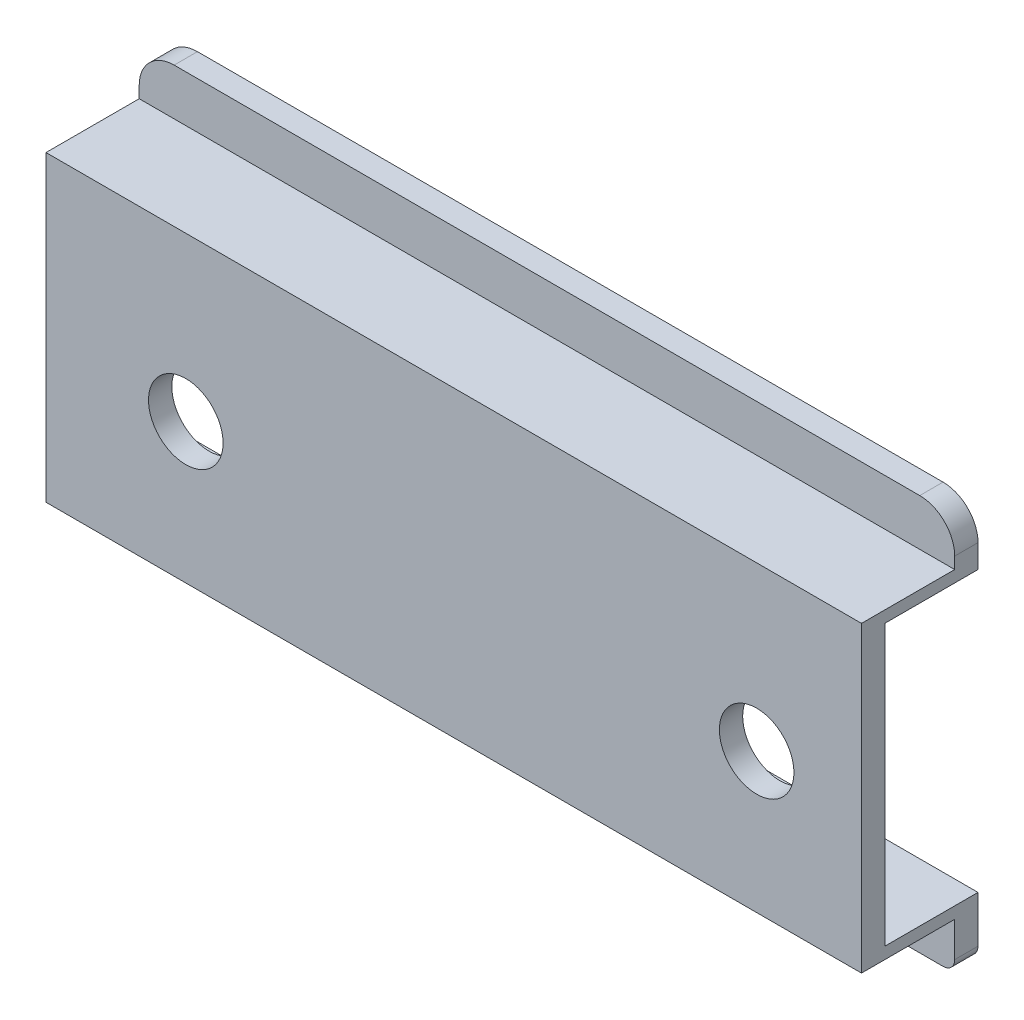
ISO-10303-21;
HEADER;
FILE_DESCRIPTION(('STEP AP214'),'2;1');
FILE_NAME('part.step','',(''),(''),'','','');
FILE_SCHEMA(('AUTOMOTIVE_DESIGN { 1 0 10303 214 1 1 1 1 }'));
ENDSEC;
DATA;
#1=APPLICATION_CONTEXT('core data for automotive mechanical design processes');
#2=APPLICATION_PROTOCOL_DEFINITION('international standard','automotive_design',2000,#1);
#3=PRODUCT_CONTEXT('',#1,'mechanical');
#4=PRODUCT('Part','Part','',(#3));
#5=PRODUCT_RELATED_PRODUCT_CATEGORY('part','',(#4));
#6=PRODUCT_DEFINITION_FORMATION('','',#4);
#7=PRODUCT_DEFINITION_CONTEXT('part definition',#1,'design');
#8=PRODUCT_DEFINITION('design','',#6,#7);
#9=PRODUCT_DEFINITION_SHAPE('','',#8);
#10=(LENGTH_UNIT() NAMED_UNIT(*) SI_UNIT(.MILLI.,.METRE.));
#11=(NAMED_UNIT(*) PLANE_ANGLE_UNIT() SI_UNIT($,.RADIAN.));
#12=(NAMED_UNIT(*) SI_UNIT($,.STERADIAN.) SOLID_ANGLE_UNIT());
#13=UNCERTAINTY_MEASURE_WITH_UNIT(LENGTH_MEASURE(1.E-05),#10,'distance_accuracy_value','');
#14=(GEOMETRIC_REPRESENTATION_CONTEXT(3) GLOBAL_UNCERTAINTY_ASSIGNED_CONTEXT((#13)) GLOBAL_UNIT_ASSIGNED_CONTEXT((#10,
#11,#12)) REPRESENTATION_CONTEXT('',''));
#15=CARTESIAN_POINT('',(0.,0.,0.));
#16=DIRECTION('',(0.,0.,1.));
#17=DIRECTION('',(1.,0.,0.));
#18=AXIS2_PLACEMENT_3D('',#15,#16,#17);
#19=CARTESIAN_POINT('',(-148.81074168798,103.606138107417,50.));
#20=DIRECTION('',(0.,0.,-1.));
#21=DIRECTION('',(-1.,0.,0.));
#22=AXIS2_PLACEMENT_3D('',#19,#20,#21);
#23=CYLINDRICAL_SURFACE('',#22,15.);
#24=DIRECTION('',(0.,0.,-1.));
#25=VECTOR('',#24,1.);
#26=CARTESIAN_POINT('',(-163.81074168798,103.606138107417,50.));
#27=LINE('',#26,#25);
#28=CARTESIAN_POINT('',(-163.81074168798,103.606138107417,10.));
#29=VERTEX_POINT('',#28);
#30=CARTESIAN_POINT('',(-163.81074168798,103.606138107417,0.));
#31=VERTEX_POINT('',#30);
#32=EDGE_CURVE('E269',#29,#31,#27,.T.);
#33=ORIENTED_EDGE('',*,*,#32,.F.);
#34=CARTESIAN_POINT('',(-148.81074168798,103.606138107417,10.));
#35=DIRECTION('',(0.,0.,1.));
#36=DIRECTION('',(1.,0.,0.));
#37=AXIS2_PLACEMENT_3D('',#34,#35,#36);
#38=CIRCLE('',#37,15.);
#39=CARTESIAN_POINT('',(-148.81074168798,118.606138107417,10.));
#40=VERTEX_POINT('',#39);
#41=EDGE_CURVE('E42',#40,#29,#38,.T.);
#42=ORIENTED_EDGE('',*,*,#41,.F.);
#43=DIRECTION('',(0.,0.,-1.));
#44=VECTOR('',#43,1.);
#45=CARTESIAN_POINT('',(-148.81074168798,118.606138107417,50.));
#46=LINE('',#45,#44);
#47=CARTESIAN_POINT('',(-148.81074168798,118.606138107417,0.));
#48=VERTEX_POINT('',#47);
#49=EDGE_CURVE('E272',#48,#40,#46,.F.);
#50=ORIENTED_EDGE('',*,*,#49,.F.);
#51=CARTESIAN_POINT('',(-148.81074168798,103.606138107417,0.));
#52=DIRECTION('',(0.,0.,-1.));
#53=DIRECTION('',(-1.,0.,0.));
#54=AXIS2_PLACEMENT_3D('',#51,#52,#53);
#55=CIRCLE('',#54,15.);
#56=EDGE_CURVE('E11',#31,#48,#55,.T.);
#57=ORIENTED_EDGE('',*,*,#56,.F.);
#58=EDGE_LOOP('',(#33,#42,#50,#57));
#59=FACE_BOUND('',#58,.T.);
#60=ADVANCED_FACE('F35',(#59),#23,.T.);
#61=CARTESIAN_POINT('',(171.18925831202,103.606138107417,50.));
#62=DIRECTION('',(0.,0.,1.));
#63=DIRECTION('',(1.,0.,0.));
#64=AXIS2_PLACEMENT_3D('',#61,#62,#63);
#65=CYLINDRICAL_SURFACE('',#64,15.);
#66=DIRECTION('',(0.,0.,1.));
#67=VECTOR('',#66,1.);
#68=CARTESIAN_POINT('',(186.18925831202,103.606138107417,50.));
#69=LINE('',#68,#67);
#70=CARTESIAN_POINT('',(186.18925831202,103.606138107417,0.));
#71=VERTEX_POINT('',#70);
#72=CARTESIAN_POINT('',(186.18925831202,103.606138107417,10.));
#73=VERTEX_POINT('',#72);
#74=EDGE_CURVE('E259',#71,#73,#69,.T.);
#75=ORIENTED_EDGE('',*,*,#74,.F.);
#76=CARTESIAN_POINT('',(171.18925831202,103.606138107417,0.));
#77=DIRECTION('',(0.,0.,-1.));
#78=DIRECTION('',(-1.,0.,0.));
#79=AXIS2_PLACEMENT_3D('',#76,#77,#78);
#80=CIRCLE('',#79,15.);
#81=CARTESIAN_POINT('',(171.18925831202,118.606138107417,0.));
#82=VERTEX_POINT('',#81);
#83=EDGE_CURVE('E265',#82,#71,#80,.T.);
#84=ORIENTED_EDGE('',*,*,#83,.F.);
#85=DIRECTION('',(0.,0.,1.));
#86=VECTOR('',#85,1.);
#87=CARTESIAN_POINT('',(171.18925831202,118.606138107417,50.));
#88=LINE('',#87,#86);
#89=CARTESIAN_POINT('',(171.18925831202,118.606138107417,10.));
#90=VERTEX_POINT('',#89);
#91=EDGE_CURVE('E262',#90,#82,#88,.F.);
#92=ORIENTED_EDGE('',*,*,#91,.F.);
#93=CARTESIAN_POINT('',(171.18925831202,103.606138107417,10.));
#94=DIRECTION('',(0.,0.,1.));
#95=DIRECTION('',(1.,0.,0.));
#96=AXIS2_PLACEMENT_3D('',#93,#94,#95);
#97=CIRCLE('',#96,15.);
#98=EDGE_CURVE('E267',#73,#90,#97,.T.);
#99=ORIENTED_EDGE('',*,*,#98,.F.);
#100=EDGE_LOOP('',(#75,#84,#92,#99));
#101=FACE_BOUND('',#100,.T.);
#102=ADVANCED_FACE('F295',(#101),#65,.T.);
#103=CARTESIAN_POINT('',(181.18925831202,-46.3938618925831,50.));
#104=DIRECTION('',(0.,0.,-1.));
#105=DIRECTION('',(-1.,0.,0.));
#106=AXIS2_PLACEMENT_3D('',#103,#104,#105);
#107=CYLINDRICAL_SURFACE('',#106,5.);
#108=DIRECTION('',(0.,0.,-1.));
#109=VECTOR('',#108,1.);
#110=CARTESIAN_POINT('',(186.18925831202,-46.3938618925831,50.));
#111=LINE('',#110,#109);
#112=CARTESIAN_POINT('',(186.18925831202,-46.3938618925831,10.));
#113=VERTEX_POINT('',#112);
#114=CARTESIAN_POINT('',(186.18925831202,-46.3938618925831,0.));
#115=VERTEX_POINT('',#114);
#116=EDGE_CURVE('E250',#113,#115,#111,.T.);
#117=ORIENTED_EDGE('',*,*,#116,.F.);
#118=CARTESIAN_POINT('',(181.18925831202,-46.3938618925831,10.));
#119=DIRECTION('',(0.,0.,-1.));
#120=DIRECTION('',(-1.,0.,0.));
#121=AXIS2_PLACEMENT_3D('',#118,#119,#120);
#122=CIRCLE('',#121,5.);
#123=CARTESIAN_POINT('',(181.18925831202,-51.3938618925832,10.));
#124=VERTEX_POINT('',#123);
#125=EDGE_CURVE('E255',#124,#113,#122,.F.);
#126=ORIENTED_EDGE('',*,*,#125,.F.);
#127=DIRECTION('',(0.,0.,-1.));
#128=VECTOR('',#127,1.);
#129=CARTESIAN_POINT('',(181.18925831202,-51.3938618925831,50.));
#130=LINE('',#129,#128);
#131=CARTESIAN_POINT('',(181.18925831202,-51.3938618925831,0.));
#132=VERTEX_POINT('',#131);
#133=EDGE_CURVE('E252',#132,#124,#130,.F.);
#134=ORIENTED_EDGE('',*,*,#133,.F.);
#135=CARTESIAN_POINT('',(181.18925831202,-46.3938618925831,0.));
#136=DIRECTION('',(0.,0.,-1.));
#137=DIRECTION('',(-1.,0.,0.));
#138=AXIS2_PLACEMENT_3D('',#135,#136,#137);
#139=CIRCLE('',#138,5.);
#140=EDGE_CURVE('E257',#115,#132,#139,.T.);
#141=ORIENTED_EDGE('',*,*,#140,.F.);
#142=EDGE_LOOP('',(#117,#126,#134,#141));
#143=FACE_BOUND('',#142,.T.);
#144=ADVANCED_FACE('F339',(#143),#107,.T.);
#145=CARTESIAN_POINT('',(-158.81074168798,-46.3938618925832,50.));
#146=DIRECTION('',(0.,0.,1.));
#147=DIRECTION('',(1.,0.,0.));
#148=AXIS2_PLACEMENT_3D('',#145,#146,#147);
#149=CYLINDRICAL_SURFACE('',#148,5.);
#150=DIRECTION('',(0.,0.,1.));
#151=VECTOR('',#150,1.);
#152=CARTESIAN_POINT('',(-163.81074168798,-46.3938618925832,50.));
#153=LINE('',#152,#151);
#154=CARTESIAN_POINT('',(-163.81074168798,-46.3938618925832,0.));
#155=VERTEX_POINT('',#154);
#156=CARTESIAN_POINT('',(-163.81074168798,-46.3938618925832,10.));
#157=VERTEX_POINT('',#156);
#158=EDGE_CURVE('E223',#155,#157,#153,.T.);
#159=ORIENTED_EDGE('',*,*,#158,.F.);
#160=CARTESIAN_POINT('',(-158.81074168798,-46.3938618925832,0.));
#161=DIRECTION('',(0.,0.,-1.));
#162=DIRECTION('',(-1.,0.,0.));
#163=AXIS2_PLACEMENT_3D('',#160,#161,#162);
#164=CIRCLE('',#163,5.);
#165=CARTESIAN_POINT('',(-158.81074168798,-51.3938618925832,0.));
#166=VERTEX_POINT('',#165);
#167=EDGE_CURVE('E246',#166,#155,#164,.T.);
#168=ORIENTED_EDGE('',*,*,#167,.F.);
#169=DIRECTION('',(0.,0.,1.));
#170=VECTOR('',#169,1.);
#171=CARTESIAN_POINT('',(-158.81074168798,-51.3938618925832,50.));
#172=LINE('',#171,#170);
#173=CARTESIAN_POINT('',(-158.81074168798,-51.3938618925832,10.));
#174=VERTEX_POINT('',#173);
#175=EDGE_CURVE('E243',#174,#166,#172,.F.);
#176=ORIENTED_EDGE('',*,*,#175,.F.);
#177=CARTESIAN_POINT('',(-158.81074168798,-46.3938618925832,10.));
#178=DIRECTION('',(0.,0.,-1.));
#179=DIRECTION('',(-1.,0.,0.));
#180=AXIS2_PLACEMENT_3D('',#177,#178,#179);
#181=CIRCLE('',#180,5.);
#182=EDGE_CURVE('E248',#157,#174,#181,.F.);
#183=ORIENTED_EDGE('',*,*,#182,.F.);
#184=EDGE_LOOP('',(#159,#168,#176,#183));
#185=FACE_BOUND('',#184,.T.);
#186=ADVANCED_FACE('F343',(#185),#149,.T.);
#187=CARTESIAN_POINT('',(0.,0.,0.));
#188=DIRECTION('',(0.,0.,-1.));
#189=DIRECTION('',(-1.,0.,0.));
#190=AXIS2_PLACEMENT_3D('',#187,#188,#189);
#191=PLANE('',#190);
#192=DIRECTION('',(0.,-1.,0.));
#193=VECTOR('',#192,1.);
#194=CARTESIAN_POINT('',(-163.81074168798,-51.3938618925832,0.));
#195=LINE('',#194,#193);
#196=CARTESIAN_POINT('',(-163.81074168798,93.6061381074169,0.));
#197=VERTEX_POINT('',#196);
#198=EDGE_CURVE('E224',#31,#197,#195,.T.);
#199=ORIENTED_EDGE('',*,*,#198,.F.);
#200=ORIENTED_EDGE('',*,*,#56,.T.);
#201=DIRECTION('',(-1.,0.,0.));
#202=VECTOR('',#201,1.);
#203=CARTESIAN_POINT('',(-163.81074168798,118.606138107417,0.));
#204=LINE('',#203,#202);
#205=EDGE_CURVE('E220',#82,#48,#204,.T.);
#206=ORIENTED_EDGE('',*,*,#205,.F.);
#207=ORIENTED_EDGE('',*,*,#83,.T.);
#208=DIRECTION('',(0.,1.,0.));
#209=VECTOR('',#208,1.);
#210=CARTESIAN_POINT('',(186.18925831202,118.606138107417,0.));
#211=LINE('',#210,#209);
#212=CARTESIAN_POINT('',(186.18925831202,93.6061381074169,0.));
#213=VERTEX_POINT('',#212);
#214=EDGE_CURVE('E229',#213,#71,#211,.T.);
#215=ORIENTED_EDGE('',*,*,#214,.F.);
#216=DIRECTION('',(1.,0.,0.));
#217=VECTOR('',#216,1.);
#218=CARTESIAN_POINT('',(186.18925831202,93.6061381074169,0.));
#219=LINE('',#218,#217);
#220=EDGE_CURVE('E165',#197,#213,#219,.T.);
#221=ORIENTED_EDGE('',*,*,#220,.F.);
#222=EDGE_LOOP('',(#199,#200,#206,#207,#215,#221));
#223=FACE_BOUND('',#222,.T.);
#224=ADVANCED_FACE('F298',(#223),#191,.T.);
#225=CARTESIAN_POINT('',(-163.81074168798,118.606138107417,50.));
#226=DIRECTION('',(0.,-1.,0.));
#227=DIRECTION('',(0.,0.,-1.));
#228=AXIS2_PLACEMENT_3D('',#225,#226,#227);
#229=PLANE('',#228);
#230=ORIENTED_EDGE('',*,*,#205,.T.);
#231=ORIENTED_EDGE('',*,*,#49,.T.);
#232=DIRECTION('',(-1.,0.,0.));
#233=VECTOR('',#232,1.);
#234=CARTESIAN_POINT('',(-163.81074168798,118.606138107417,10.));
#235=LINE('',#234,#233);
#236=EDGE_CURVE('E207',#90,#40,#235,.T.);
#237=ORIENTED_EDGE('',*,*,#236,.F.);
#238=ORIENTED_EDGE('',*,*,#91,.T.);
#239=EDGE_LOOP('',(#230,#231,#237,#238));
#240=FACE_BOUND('',#239,.T.);
#241=ADVANCED_FACE('F297',(#240),#229,.F.);
#242=CARTESIAN_POINT('',(-163.81074168798,-51.3938618925832,50.));
#243=DIRECTION('',(1.,0.,0.));
#244=DIRECTION('',(0.,0.,-1.));
#245=AXIS2_PLACEMENT_3D('',#242,#243,#244);
#246=PLANE('',#245);
#247=DIRECTION('',(0.,-1.,0.));
#248=VECTOR('',#247,1.);
#249=CARTESIAN_POINT('',(-163.81074168798,118.606138107417,10.));
#250=LINE('',#249,#248);
#251=CARTESIAN_POINT('',(-163.81074168798,98.6061381074169,10.));
#252=VERTEX_POINT('',#251);
#253=EDGE_CURVE('E198',#29,#252,#250,.T.);
#254=ORIENTED_EDGE('',*,*,#253,.F.);
#255=ORIENTED_EDGE('',*,*,#32,.T.);
#256=ORIENTED_EDGE('',*,*,#198,.T.);
#257=DIRECTION('',(0.,0.,-1.));
#258=VECTOR('',#257,1.);
#259=CARTESIAN_POINT('',(-163.81074168798,93.6061381074169,40.));
#260=LINE('',#259,#258);
#261=CARTESIAN_POINT('',(-163.81074168798,93.6061381074169,40.));
#262=VERTEX_POINT('',#261);
#263=EDGE_CURVE('E173',#262,#197,#260,.T.);
#264=ORIENTED_EDGE('',*,*,#263,.F.);
#265=DIRECTION('',(0.,1.,0.));
#266=VECTOR('',#265,1.);
#267=CARTESIAN_POINT('',(-163.81074168798,93.6061381074169,40.));
#268=LINE('',#267,#266);
#269=CARTESIAN_POINT('',(-163.81074168798,-26.3938618925831,40.));
#270=VERTEX_POINT('',#269);
#271=EDGE_CURVE('E155',#270,#262,#268,.T.);
#272=ORIENTED_EDGE('',*,*,#271,.F.);
#273=DIRECTION('',(0.,0.,-1.));
#274=VECTOR('',#273,1.);
#275=CARTESIAN_POINT('',(-163.81074168798,-26.3938618925831,40.));
#276=LINE('',#275,#274);
#277=CARTESIAN_POINT('',(-163.81074168798,-26.3938618925831,0.));
#278=VERTEX_POINT('',#277);
#279=EDGE_CURVE('E152',#270,#278,#276,.T.);
#280=ORIENTED_EDGE('',*,*,#279,.T.);
#281=EDGE_CURVE('E196',#278,#155,#195,.T.);
#282=ORIENTED_EDGE('',*,*,#281,.T.);
#283=ORIENTED_EDGE('',*,*,#158,.T.);
#284=DIRECTION('',(0.,-1.,0.));
#285=VECTOR('',#284,1.);
#286=CARTESIAN_POINT('',(-163.81074168798,-51.3938618925832,10.));
#287=LINE('',#286,#285);
#288=CARTESIAN_POINT('',(-163.81074168798,-31.3938618925832,10.));
#289=VERTEX_POINT('',#288);
#290=EDGE_CURVE('E178',#289,#157,#287,.T.);
#291=ORIENTED_EDGE('',*,*,#290,.F.);
#292=DIRECTION('',(0.,0.,1.));
#293=VECTOR('',#292,1.);
#294=CARTESIAN_POINT('',(-163.81074168798,-31.3938618925832,10.));
#295=LINE('',#294,#293);
#296=CARTESIAN_POINT('',(-163.81074168798,-31.3938618925832,50.));
#297=VERTEX_POINT('',#296);
#298=EDGE_CURVE('E193',#289,#297,#295,.T.);
#299=ORIENTED_EDGE('',*,*,#298,.T.);
#300=DIRECTION('',(0.,-1.,0.));
#301=VECTOR('',#300,1.);
#302=CARTESIAN_POINT('',(-163.81074168798,-51.3938618925832,50.));
#303=LINE('',#302,#301);
#304=CARTESIAN_POINT('',(-163.81074168798,98.6061381074169,50.));
#305=VERTEX_POINT('',#304);
#306=EDGE_CURVE('E216',#305,#297,#303,.T.);
#307=ORIENTED_EDGE('',*,*,#306,.F.);
#308=DIRECTION('',(0.,0.,1.));
#309=VECTOR('',#308,1.);
#310=CARTESIAN_POINT('',(-163.81074168798,98.6061381074169,10.));
#311=LINE('',#310,#309);
#312=EDGE_CURVE('E210',#252,#305,#311,.T.);
#313=ORIENTED_EDGE('',*,*,#312,.F.);
#314=EDGE_LOOP('',(#254,#255,#256,#264,#272,#280,#282,#283,#291,#299,#307,#313));
#315=FACE_BOUND('',#314,.T.);
#316=ADVANCED_FACE('F280',(#315),#246,.F.);
#317=CARTESIAN_POINT('',(186.18925831202,-51.3938618925831,50.));
#318=DIRECTION('',(0.,1.,0.));
#319=DIRECTION('',(-1.,0.,0.));
#320=AXIS2_PLACEMENT_3D('',#317,#318,#319);
#321=PLANE('',#320);
#322=DIRECTION('',(1.,0.,0.));
#323=VECTOR('',#322,1.);
#324=CARTESIAN_POINT('',(186.18925831202,-51.3938618925831,0.));
#325=LINE('',#324,#323);
#326=EDGE_CURVE('E226',#166,#132,#325,.T.);
#327=ORIENTED_EDGE('',*,*,#326,.T.);
#328=ORIENTED_EDGE('',*,*,#133,.T.);
#329=DIRECTION('',(1.,0.,0.));
#330=VECTOR('',#329,1.);
#331=CARTESIAN_POINT('',(-163.81074168798,-51.3938618925832,10.));
#332=LINE('',#331,#330);
#333=EDGE_CURVE('E181',#174,#124,#332,.T.);
#334=ORIENTED_EDGE('',*,*,#333,.F.);
#335=ORIENTED_EDGE('',*,*,#175,.T.);
#336=EDGE_LOOP('',(#327,#328,#334,#335));
#337=FACE_BOUND('',#336,.T.);
#338=ADVANCED_FACE('F351',(#337),#321,.F.);
#339=CARTESIAN_POINT('',(186.18925831202,118.606138107417,50.));
#340=DIRECTION('',(-1.,0.,0.));
#341=DIRECTION('',(0.,-1.,0.));
#342=AXIS2_PLACEMENT_3D('',#339,#340,#341);
#343=PLANE('',#342);
#344=ORIENTED_EDGE('',*,*,#214,.T.);
#345=ORIENTED_EDGE('',*,*,#74,.T.);
#346=DIRECTION('',(0.,1.,0.));
#347=VECTOR('',#346,1.);
#348=CARTESIAN_POINT('',(186.18925831202,118.606138107417,10.));
#349=LINE('',#348,#347);
#350=CARTESIAN_POINT('',(186.18925831202,98.6061381074169,10.));
#351=VERTEX_POINT('',#350);
#352=EDGE_CURVE('E204',#351,#73,#349,.T.);
#353=ORIENTED_EDGE('',*,*,#352,.F.);
#354=DIRECTION('',(0.,0.,1.));
#355=VECTOR('',#354,1.);
#356=CARTESIAN_POINT('',(186.18925831202,98.6061381074169,10.));
#357=LINE('',#356,#355);
#358=CARTESIAN_POINT('',(186.18925831202,98.6061381074169,50.));
#359=VERTEX_POINT('',#358);
#360=EDGE_CURVE('E192',#351,#359,#357,.T.);
#361=ORIENTED_EDGE('',*,*,#360,.T.);
#362=DIRECTION('',(0.,1.,0.));
#363=VECTOR('',#362,1.);
#364=CARTESIAN_POINT('',(186.18925831202,118.606138107417,50.));
#365=LINE('',#364,#363);
#366=CARTESIAN_POINT('',(186.18925831202,-31.3938618925832,50.));
#367=VERTEX_POINT('',#366);
#368=EDGE_CURVE('E219',#367,#359,#365,.T.);
#369=ORIENTED_EDGE('',*,*,#368,.F.);
#370=DIRECTION('',(0.,0.,1.));
#371=VECTOR('',#370,1.);
#372=CARTESIAN_POINT('',(186.18925831202,-31.3938618925832,10.));
#373=LINE('',#372,#371);
#374=CARTESIAN_POINT('',(186.18925831202,-31.3938618925832,10.));
#375=VERTEX_POINT('',#374);
#376=EDGE_CURVE('E190',#375,#367,#373,.T.);
#377=ORIENTED_EDGE('',*,*,#376,.F.);
#378=DIRECTION('',(0.,1.,0.));
#379=VECTOR('',#378,1.);
#380=CARTESIAN_POINT('',(186.18925831202,-51.3938618925832,10.));
#381=LINE('',#380,#379);
#382=EDGE_CURVE('E185',#113,#375,#381,.T.);
#383=ORIENTED_EDGE('',*,*,#382,.F.);
#384=ORIENTED_EDGE('',*,*,#116,.T.);
#385=CARTESIAN_POINT('',(186.18925831202,-26.3938618925831,0.));
#386=VERTEX_POINT('',#385);
#387=EDGE_CURVE('E171',#115,#386,#211,.T.);
#388=ORIENTED_EDGE('',*,*,#387,.T.);
#389=DIRECTION('',(0.,0.,-1.));
#390=VECTOR('',#389,1.);
#391=CARTESIAN_POINT('',(186.18925831202,-26.3938618925831,40.));
#392=LINE('',#391,#390);
#393=CARTESIAN_POINT('',(186.18925831202,-26.3938618925831,40.));
#394=VERTEX_POINT('',#393);
#395=EDGE_CURVE('E149',#394,#386,#392,.T.);
#396=ORIENTED_EDGE('',*,*,#395,.F.);
#397=DIRECTION('',(0.,-1.,0.));
#398=VECTOR('',#397,1.);
#399=CARTESIAN_POINT('',(186.18925831202,93.6061381074169,40.));
#400=LINE('',#399,#398);
#401=CARTESIAN_POINT('',(186.18925831202,93.6061381074169,40.));
#402=VERTEX_POINT('',#401);
#403=EDGE_CURVE('E156',#402,#394,#400,.T.);
#404=ORIENTED_EDGE('',*,*,#403,.F.);
#405=DIRECTION('',(0.,0.,-1.));
#406=VECTOR('',#405,1.);
#407=CARTESIAN_POINT('',(186.18925831202,93.6061381074169,40.));
#408=LINE('',#407,#406);
#409=EDGE_CURVE('E212',#402,#213,#408,.T.);
#410=ORIENTED_EDGE('',*,*,#409,.T.);
#411=EDGE_LOOP('',(#344,#345,#353,#361,#369,#377,#383,#384,#388,#396,#404,#410));
#412=FACE_BOUND('',#411,.T.);
#413=ADVANCED_FACE('F168',(#412),#343,.F.);
#414=CARTESIAN_POINT('',(0.,0.,50.));
#415=DIRECTION('',(0.,0.,-1.));
#416=DIRECTION('',(-1.,0.,0.));
#417=AXIS2_PLACEMENT_3D('',#414,#415,#416);
#418=PLANE('',#417);
#419=CARTESIAN_POINT('',(-103.81074168798,28.6061381074168,50.));
#420=DIRECTION('',(0.,0.,1.));
#421=DIRECTION('',(1.,0.,0.));
#422=AXIS2_PLACEMENT_3D('',#419,#420,#421);
#423=CIRCLE('',#422,16.);
#424=CARTESIAN_POINT('',(-87.8107416879796,28.6061381074168,50.));
#425=VERTEX_POINT('',#424);
#426=EDGE_CURVE('E237',#425,#425,#423,.T.);
#427=ORIENTED_EDGE('',*,*,#426,.F.);
#428=EDGE_LOOP('',(#427));
#429=FACE_BOUND('',#428,.T.);
#430=CARTESIAN_POINT('',(141.18925831202,28.6061381074168,50.));
#431=DIRECTION('',(0.,0.,1.));
#432=DIRECTION('',(1.,0.,0.));
#433=AXIS2_PLACEMENT_3D('',#430,#431,#432);
#434=CIRCLE('',#433,16.);
#435=CARTESIAN_POINT('',(157.18925831202,28.6061381074168,50.));
#436=VERTEX_POINT('',#435);
#437=EDGE_CURVE('E308',#436,#436,#434,.T.);
#438=ORIENTED_EDGE('',*,*,#437,.F.);
#439=EDGE_LOOP('',(#438));
#440=FACE_BOUND('',#439,.T.);
#441=ORIENTED_EDGE('',*,*,#306,.T.);
#442=DIRECTION('',(-1.,0.,0.));
#443=VECTOR('',#442,1.);
#444=CARTESIAN_POINT('',(-163.81074168798,-31.3938618925832,50.));
#445=LINE('',#444,#443);
#446=EDGE_CURVE('E182',#367,#297,#445,.T.);
#447=ORIENTED_EDGE('',*,*,#446,.F.);
#448=ORIENTED_EDGE('',*,*,#368,.T.);
#449=DIRECTION('',(1.,0.,0.));
#450=VECTOR('',#449,1.);
#451=CARTESIAN_POINT('',(-163.81074168798,98.6061381074169,50.));
#452=LINE('',#451,#450);
#453=EDGE_CURVE('E201',#305,#359,#452,.T.);
#454=ORIENTED_EDGE('',*,*,#453,.F.);
#455=EDGE_LOOP('',(#441,#447,#448,#454));
#456=FACE_BOUND('',#455,.T.);
#457=ADVANCED_FACE('F286',(#429,#440,#456),#418,.F.);
#458=ORIENTED_EDGE('',*,*,#387,.F.);
#459=ORIENTED_EDGE('',*,*,#140,.T.);
#460=ORIENTED_EDGE('',*,*,#326,.F.);
#461=ORIENTED_EDGE('',*,*,#167,.T.);
#462=ORIENTED_EDGE('',*,*,#281,.F.);
#463=DIRECTION('',(-1.,0.,0.));
#464=VECTOR('',#463,1.);
#465=CARTESIAN_POINT('',(186.18925831202,-26.3938618925831,0.));
#466=LINE('',#465,#464);
#467=EDGE_CURVE('E240',#386,#278,#466,.T.);
#468=ORIENTED_EDGE('',*,*,#467,.F.);
#469=EDGE_LOOP('',(#458,#459,#460,#461,#462,#468));
#470=FACE_BOUND('',#469,.T.);
#471=ADVANCED_FACE('F318',(#470),#191,.T.);
#472=CARTESIAN_POINT('',(-163.81074168798,98.6061381074169,10.));
#473=DIRECTION('',(0.,-1.,0.));
#474=DIRECTION('',(0.,0.,-1.));
#475=AXIS2_PLACEMENT_3D('',#472,#473,#474);
#476=PLANE('',#475);
#477=ORIENTED_EDGE('',*,*,#453,.T.);
#478=ORIENTED_EDGE('',*,*,#360,.F.);
#479=DIRECTION('',(1.,0.,0.));
#480=VECTOR('',#479,1.);
#481=CARTESIAN_POINT('',(-163.81074168798,98.6061381074169,10.));
#482=LINE('',#481,#480);
#483=EDGE_CURVE('E200',#252,#351,#482,.T.);
#484=ORIENTED_EDGE('',*,*,#483,.F.);
#485=ORIENTED_EDGE('',*,*,#312,.T.);
#486=EDGE_LOOP('',(#477,#478,#484,#485));
#487=FACE_BOUND('',#486,.T.);
#488=ADVANCED_FACE('F284',(#487),#476,.F.);
#489=CARTESIAN_POINT('',(0.,0.,10.));
#490=DIRECTION('',(0.,0.,1.));
#491=DIRECTION('',(1.,0.,0.));
#492=AXIS2_PLACEMENT_3D('',#489,#490,#491);
#493=PLANE('',#492);
#494=ORIENTED_EDGE('',*,*,#236,.T.);
#495=ORIENTED_EDGE('',*,*,#41,.T.);
#496=ORIENTED_EDGE('',*,*,#253,.T.);
#497=ORIENTED_EDGE('',*,*,#483,.T.);
#498=ORIENTED_EDGE('',*,*,#352,.T.);
#499=ORIENTED_EDGE('',*,*,#98,.T.);
#500=EDGE_LOOP('',(#494,#495,#496,#497,#498,#499));
#501=FACE_BOUND('',#500,.T.);
#502=ADVANCED_FACE('F274',(#501),#493,.T.);
#503=CARTESIAN_POINT('',(-163.81074168798,-31.3938618925832,10.));
#504=DIRECTION('',(0.,1.,0.));
#505=DIRECTION('',(0.,0.,1.));
#506=AXIS2_PLACEMENT_3D('',#503,#504,#505);
#507=PLANE('',#506);
#508=ORIENTED_EDGE('',*,*,#446,.T.);
#509=ORIENTED_EDGE('',*,*,#298,.F.);
#510=DIRECTION('',(-1.,0.,0.));
#511=VECTOR('',#510,1.);
#512=CARTESIAN_POINT('',(-163.81074168798,-31.3938618925832,10.));
#513=LINE('',#512,#511);
#514=EDGE_CURVE('E187',#375,#289,#513,.T.);
#515=ORIENTED_EDGE('',*,*,#514,.F.);
#516=ORIENTED_EDGE('',*,*,#376,.T.);
#517=EDGE_LOOP('',(#508,#509,#515,#516));
#518=FACE_BOUND('',#517,.T.);
#519=ADVANCED_FACE('F366',(#518),#507,.F.);
#520=CARTESIAN_POINT('',(0.,0.,10.));
#521=DIRECTION('',(0.,0.,-1.));
#522=DIRECTION('',(-1.,0.,0.));
#523=AXIS2_PLACEMENT_3D('',#520,#521,#522);
#524=PLANE('',#523);
#525=ORIENTED_EDGE('',*,*,#333,.T.);
#526=ORIENTED_EDGE('',*,*,#125,.T.);
#527=ORIENTED_EDGE('',*,*,#382,.T.);
#528=ORIENTED_EDGE('',*,*,#514,.T.);
#529=ORIENTED_EDGE('',*,*,#290,.T.);
#530=ORIENTED_EDGE('',*,*,#182,.T.);
#531=EDGE_LOOP('',(#525,#526,#527,#528,#529,#530));
#532=FACE_BOUND('',#531,.T.);
#533=ADVANCED_FACE('F369',(#532),#524,.F.);
#534=CARTESIAN_POINT('',(186.18925831202,93.6061381074169,40.));
#535=DIRECTION('',(0.,1.,0.));
#536=DIRECTION('',(0.,0.,1.));
#537=AXIS2_PLACEMENT_3D('',#534,#535,#536);
#538=PLANE('',#537);
#539=ORIENTED_EDGE('',*,*,#220,.T.);
#540=ORIENTED_EDGE('',*,*,#409,.F.);
#541=DIRECTION('',(1.,0.,0.));
#542=VECTOR('',#541,1.);
#543=CARTESIAN_POINT('',(186.18925831202,93.6061381074169,40.));
#544=LINE('',#543,#542);
#545=EDGE_CURVE('E162',#262,#402,#544,.T.);
#546=ORIENTED_EDGE('',*,*,#545,.F.);
#547=ORIENTED_EDGE('',*,*,#263,.T.);
#548=EDGE_LOOP('',(#539,#540,#546,#547));
#549=FACE_BOUND('',#548,.T.);
#550=ADVANCED_FACE('F373',(#549),#538,.F.);
#551=CARTESIAN_POINT('',(186.18925831202,-26.3938618925831,40.));
#552=DIRECTION('',(0.,-1.,0.));
#553=DIRECTION('',(1.,0.,0.));
#554=AXIS2_PLACEMENT_3D('',#551,#552,#553);
#555=PLANE('',#554);
#556=ORIENTED_EDGE('',*,*,#467,.T.);
#557=ORIENTED_EDGE('',*,*,#279,.F.);
#558=DIRECTION('',(-1.,0.,0.));
#559=VECTOR('',#558,1.);
#560=CARTESIAN_POINT('',(186.18925831202,-26.3938618925831,40.));
#561=LINE('',#560,#559);
#562=EDGE_CURVE('E145',#394,#270,#561,.T.);
#563=ORIENTED_EDGE('',*,*,#562,.F.);
#564=ORIENTED_EDGE('',*,*,#395,.T.);
#565=EDGE_LOOP('',(#556,#557,#563,#564));
#566=FACE_BOUND('',#565,.T.);
#567=ADVANCED_FACE('F147',(#566),#555,.F.);
#568=CARTESIAN_POINT('',(0.,0.,40.));
#569=DIRECTION('',(0.,0.,-1.));
#570=DIRECTION('',(-1.,0.,0.));
#571=AXIS2_PLACEMENT_3D('',#568,#569,#570);
#572=PLANE('',#571);
#573=CARTESIAN_POINT('',(-103.81074168798,28.6061381074168,40.));
#574=DIRECTION('',(0.,0.,-1.));
#575=DIRECTION('',(-1.,0.,0.));
#576=AXIS2_PLACEMENT_3D('',#573,#574,#575);
#577=CIRCLE('',#576,16.);
#578=CARTESIAN_POINT('',(-119.81074168798,28.6061381074168,40.));
#579=VERTEX_POINT('',#578);
#580=EDGE_CURVE('E236',#579,#579,#577,.T.);
#581=ORIENTED_EDGE('',*,*,#580,.F.);
#582=EDGE_LOOP('',(#581));
#583=FACE_BOUND('',#582,.T.);
#584=CARTESIAN_POINT('',(141.18925831202,28.6061381074168,40.));
#585=DIRECTION('',(0.,0.,-1.));
#586=DIRECTION('',(-1.,0.,0.));
#587=AXIS2_PLACEMENT_3D('',#584,#585,#586);
#588=CIRCLE('',#587,16.);
#589=CARTESIAN_POINT('',(125.18925831202,28.6061381074168,40.));
#590=VERTEX_POINT('',#589);
#591=EDGE_CURVE('E233',#590,#590,#588,.T.);
#592=ORIENTED_EDGE('',*,*,#591,.F.);
#593=EDGE_LOOP('',(#592));
#594=FACE_BOUND('',#593,.T.);
#595=ORIENTED_EDGE('',*,*,#403,.T.);
#596=ORIENTED_EDGE('',*,*,#562,.T.);
#597=ORIENTED_EDGE('',*,*,#271,.T.);
#598=ORIENTED_EDGE('',*,*,#545,.T.);
#599=EDGE_LOOP('',(#595,#596,#597,#598));
#600=FACE_BOUND('',#599,.T.);
#601=ADVANCED_FACE('F160',(#583,#594,#600),#572,.T.);
#602=CARTESIAN_POINT('',(141.18925831202,28.6061381074168,0.));
#603=DIRECTION('',(0.,0.,1.));
#604=DIRECTION('',(1.,0.,0.));
#605=AXIS2_PLACEMENT_3D('',#602,#603,#604);
#606=CYLINDRICAL_SURFACE('',#605,16.);
#607=ORIENTED_EDGE('',*,*,#591,.T.);
#608=EDGE_LOOP('',(#607));
#609=FACE_BOUND('',#608,.T.);
#610=ORIENTED_EDGE('',*,*,#437,.T.);
#611=EDGE_LOOP('',(#610));
#612=FACE_BOUND('',#611,.T.);
#613=ADVANCED_FACE('F322',(#609,#612),#606,.F.);
#614=CARTESIAN_POINT('',(-103.81074168798,28.6061381074168,0.));
#615=DIRECTION('',(0.,0.,1.));
#616=DIRECTION('',(1.,0.,0.));
#617=AXIS2_PLACEMENT_3D('',#614,#615,#616);
#618=CYLINDRICAL_SURFACE('',#617,16.);
#619=ORIENTED_EDGE('',*,*,#580,.T.);
#620=EDGE_LOOP('',(#619));
#621=FACE_BOUND('',#620,.T.);
#622=ORIENTED_EDGE('',*,*,#426,.T.);
#623=EDGE_LOOP('',(#622));
#624=FACE_BOUND('',#623,.T.);
#625=ADVANCED_FACE('F314',(#621,#624),#618,.F.);
#626=CLOSED_SHELL('',(#60,#102,#144,#186,#224,#241,#316,#338,#413,#457,#471,#488,#502,#519,#533,
#550,#567,#601,#613,#625));
#627=MANIFOLD_SOLID_BREP('B2',#626);
#628=ADVANCED_BREP_SHAPE_REPRESENTATION('',(#18,#627),#14);
#629=SHAPE_DEFINITION_REPRESENTATION(#9,#628);
ENDSEC;
END-ISO-10303-21;
